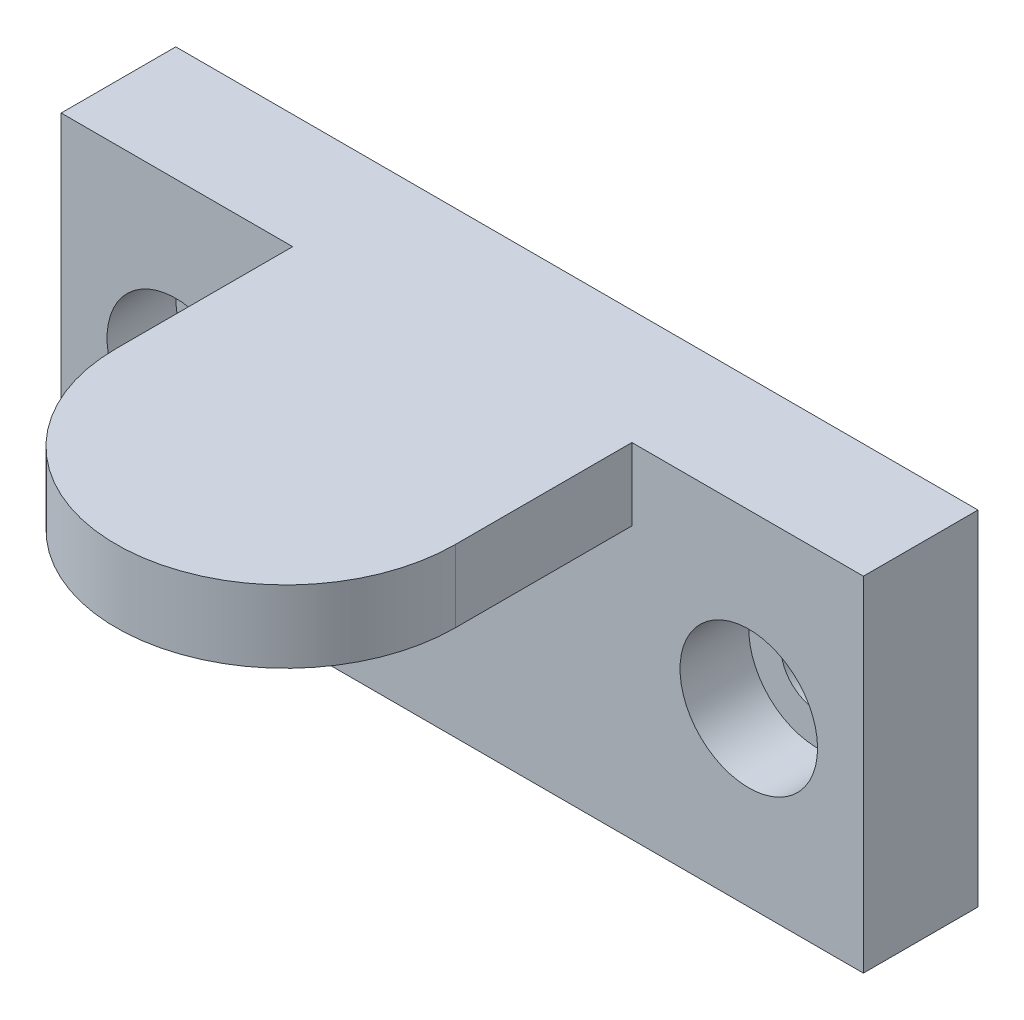
ISO-10303-21;
HEADER;
FILE_DESCRIPTION(('STEP AP214'),'2;1');
FILE_NAME('part.step','',(''),(''),'','','');
FILE_SCHEMA(('AUTOMOTIVE_DESIGN { 1 0 10303 214 1 1 1 1 }'));
ENDSEC;
DATA;
#1=APPLICATION_CONTEXT('core data for automotive mechanical design processes');
#2=APPLICATION_PROTOCOL_DEFINITION('international standard','automotive_design',2000,#1);
#3=PRODUCT_CONTEXT('',#1,'mechanical');
#4=PRODUCT('Part','Part','',(#3));
#5=PRODUCT_RELATED_PRODUCT_CATEGORY('part','',(#4));
#6=PRODUCT_DEFINITION_FORMATION('','',#4);
#7=PRODUCT_DEFINITION_CONTEXT('part definition',#1,'design');
#8=PRODUCT_DEFINITION('design','',#6,#7);
#9=PRODUCT_DEFINITION_SHAPE('','',#8);
#10=(LENGTH_UNIT() NAMED_UNIT(*) SI_UNIT(.MILLI.,.METRE.));
#11=(NAMED_UNIT(*) PLANE_ANGLE_UNIT() SI_UNIT($,.RADIAN.));
#12=(NAMED_UNIT(*) SI_UNIT($,.STERADIAN.) SOLID_ANGLE_UNIT());
#13=UNCERTAINTY_MEASURE_WITH_UNIT(LENGTH_MEASURE(1.E-05),#10,'distance_accuracy_value','');
#14=(GEOMETRIC_REPRESENTATION_CONTEXT(3) GLOBAL_UNCERTAINTY_ASSIGNED_CONTEXT((#13)) GLOBAL_UNIT_ASSIGNED_CONTEXT((#10,
#11,#12)) REPRESENTATION_CONTEXT('',''));
#15=CARTESIAN_POINT('',(0.,0.,0.));
#16=DIRECTION('',(0.,0.,1.));
#17=DIRECTION('',(1.,0.,0.));
#18=AXIS2_PLACEMENT_3D('',#15,#16,#17);
#19=CARTESIAN_POINT('',(0.,0.,10.));
#20=DIRECTION('',(1.,0.,0.));
#21=DIRECTION('',(0.,1.,0.));
#22=AXIS2_PLACEMENT_3D('',#19,#20,#21);
#23=PLANE('',#22);
#24=DIRECTION('',(0.,-1.,0.));
#25=VECTOR('',#24,1.);
#26=CARTESIAN_POINT('',(0.,0.,0.));
#27=LINE('',#26,#25);
#28=CARTESIAN_POINT('',(0.,0.,0.));
#29=VERTEX_POINT('',#28);
#30=CARTESIAN_POINT('',(0.,-30.,0.));
#31=VERTEX_POINT('',#30);
#32=EDGE_CURVE('E202',#29,#31,#27,.T.);
#33=ORIENTED_EDGE('',*,*,#32,.T.);
#34=DIRECTION('',(0.,0.,-1.));
#35=VECTOR('',#34,1.);
#36=CARTESIAN_POINT('',(0.,-30.,10.));
#37=LINE('',#36,#35);
#38=CARTESIAN_POINT('',(0.,-30.,10.));
#39=VERTEX_POINT('',#38);
#40=EDGE_CURVE('E12',#39,#31,#37,.T.);
#41=ORIENTED_EDGE('',*,*,#40,.F.);
#42=DIRECTION('',(0.,-1.,0.));
#43=VECTOR('',#42,1.);
#44=CARTESIAN_POINT('',(0.,0.,10.));
#45=LINE('',#44,#43);
#46=CARTESIAN_POINT('',(0.,0.,10.));
#47=VERTEX_POINT('',#46);
#48=EDGE_CURVE('E214',#47,#39,#45,.T.);
#49=ORIENTED_EDGE('',*,*,#48,.F.);
#50=DIRECTION('',(0.,0.,-1.));
#51=VECTOR('',#50,1.);
#52=CARTESIAN_POINT('',(0.,0.,10.));
#53=LINE('',#52,#51);
#54=EDGE_CURVE('E225',#47,#29,#53,.T.);
#55=ORIENTED_EDGE('',*,*,#54,.T.);
#56=EDGE_LOOP('',(#33,#41,#49,#55));
#57=FACE_BOUND('',#56,.T.);
#58=ADVANCED_FACE('F60',(#57),#23,.F.);
#59=CARTESIAN_POINT('',(0.,-30.,10.));
#60=DIRECTION('',(0.,1.,0.));
#61=DIRECTION('',(0.,0.,1.));
#62=AXIS2_PLACEMENT_3D('',#59,#60,#61);
#63=PLANE('',#62);
#64=DIRECTION('',(1.,0.,0.));
#65=VECTOR('',#64,1.);
#66=CARTESIAN_POINT('',(0.,-30.,0.));
#67=LINE('',#66,#65);
#68=CARTESIAN_POINT('',(70.,-30.,0.));
#69=VERTEX_POINT('',#68);
#70=EDGE_CURVE('E229',#31,#69,#67,.T.);
#71=ORIENTED_EDGE('',*,*,#70,.T.);
#72=DIRECTION('',(0.,0.,-1.));
#73=VECTOR('',#72,1.);
#74=CARTESIAN_POINT('',(70.,-30.,10.));
#75=LINE('',#74,#73);
#76=CARTESIAN_POINT('',(70.,-30.,10.));
#77=VERTEX_POINT('',#76);
#78=EDGE_CURVE('E68',#77,#69,#75,.T.);
#79=ORIENTED_EDGE('',*,*,#78,.F.);
#80=DIRECTION('',(1.,0.,0.));
#81=VECTOR('',#80,1.);
#82=CARTESIAN_POINT('',(0.,-30.,10.));
#83=LINE('',#82,#81);
#84=EDGE_CURVE('E112',#39,#77,#83,.T.);
#85=ORIENTED_EDGE('',*,*,#84,.F.);
#86=ORIENTED_EDGE('',*,*,#40,.T.);
#87=EDGE_LOOP('',(#71,#79,#85,#86));
#88=FACE_BOUND('',#87,.T.);
#89=ADVANCED_FACE('F272',(#88),#63,.F.);
#90=CARTESIAN_POINT('',(70.,0.,10.));
#91=DIRECTION('',(-1.,0.,0.));
#92=DIRECTION('',(0.,-1.,0.));
#93=AXIS2_PLACEMENT_3D('',#90,#91,#92);
#94=PLANE('',#93);
#95=DIRECTION('',(0.,1.,0.));
#96=VECTOR('',#95,1.);
#97=CARTESIAN_POINT('',(70.,0.,0.));
#98=LINE('',#97,#96);
#99=CARTESIAN_POINT('',(70.,0.,0.));
#100=VERTEX_POINT('',#99);
#101=EDGE_CURVE('E232',#69,#100,#98,.T.);
#102=ORIENTED_EDGE('',*,*,#101,.T.);
#103=DIRECTION('',(0.,0.,-1.));
#104=VECTOR('',#103,1.);
#105=CARTESIAN_POINT('',(70.,0.,10.));
#106=LINE('',#105,#104);
#107=CARTESIAN_POINT('',(70.,0.,10.));
#108=VERTEX_POINT('',#107);
#109=EDGE_CURVE('E239',#108,#100,#106,.T.);
#110=ORIENTED_EDGE('',*,*,#109,.F.);
#111=DIRECTION('',(0.,1.,0.));
#112=VECTOR('',#111,1.);
#113=CARTESIAN_POINT('',(70.,0.,10.));
#114=LINE('',#113,#112);
#115=EDGE_CURVE('E219',#77,#108,#114,.T.);
#116=ORIENTED_EDGE('',*,*,#115,.F.);
#117=ORIENTED_EDGE('',*,*,#78,.T.);
#118=EDGE_LOOP('',(#102,#110,#116,#117));
#119=FACE_BOUND('',#118,.T.);
#120=ADVANCED_FACE('F246',(#119),#94,.F.);
#121=CARTESIAN_POINT('',(0.,0.,10.));
#122=DIRECTION('',(0.,-1.,0.));
#123=DIRECTION('',(0.,0.,-1.));
#124=AXIS2_PLACEMENT_3D('',#121,#122,#123);
#125=PLANE('',#124);
#126=DIRECTION('',(-1.,0.,0.));
#127=VECTOR('',#126,1.);
#128=CARTESIAN_POINT('',(0.,0.,0.));
#129=LINE('',#128,#127);
#130=EDGE_CURVE('E105',#100,#29,#129,.T.);
#131=ORIENTED_EDGE('',*,*,#130,.T.);
#132=ORIENTED_EDGE('',*,*,#54,.F.);
#133=DIRECTION('',(-1.,0.,0.));
#134=VECTOR('',#133,1.);
#135=CARTESIAN_POINT('',(0.,0.,10.));
#136=LINE('',#135,#134);
#137=CARTESIAN_POINT('',(20.2,0.,10.));
#138=VERTEX_POINT('',#137);
#139=EDGE_CURVE('E83',#138,#47,#136,.T.);
#140=ORIENTED_EDGE('',*,*,#139,.F.);
#141=DIRECTION('',(0.,0.,-1.));
#142=VECTOR('',#141,1.);
#143=CARTESIAN_POINT('',(20.2,0.,25.4));
#144=LINE('',#143,#142);
#145=CARTESIAN_POINT('',(20.2,0.,25.4));
#146=VERTEX_POINT('',#145);
#147=EDGE_CURVE('E75',#146,#138,#144,.T.);
#148=ORIENTED_EDGE('',*,*,#147,.F.);
#149=CARTESIAN_POINT('',(35.,0.,25.4));
#150=DIRECTION('',(0.,1.,0.));
#151=DIRECTION('',(0.,0.,1.));
#152=AXIS2_PLACEMENT_3D('',#149,#150,#151);
#153=CIRCLE('',#152,14.8);
#154=CARTESIAN_POINT('',(49.8,0.,25.4));
#155=VERTEX_POINT('',#154);
#156=EDGE_CURVE('E139',#146,#155,#153,.T.);
#157=ORIENTED_EDGE('',*,*,#156,.T.);
#158=DIRECTION('',(0.,0.,-1.));
#159=VECTOR('',#158,1.);
#160=CARTESIAN_POINT('',(49.8,0.,25.4));
#161=LINE('',#160,#159);
#162=CARTESIAN_POINT('',(49.8,0.,10.));
#163=VERTEX_POINT('',#162);
#164=EDGE_CURVE('E149',#155,#163,#161,.T.);
#165=ORIENTED_EDGE('',*,*,#164,.T.);
#166=EDGE_CURVE('E222',#108,#163,#136,.T.);
#167=ORIENTED_EDGE('',*,*,#166,.F.);
#168=ORIENTED_EDGE('',*,*,#109,.T.);
#169=EDGE_LOOP('',(#131,#132,#140,#148,#157,#165,#167,#168));
#170=FACE_BOUND('',#169,.T.);
#171=ADVANCED_FACE('F158',(#170),#125,.F.);
#172=CARTESIAN_POINT('',(0.,0.,10.));
#173=DIRECTION('',(0.,0.,1.));
#174=DIRECTION('',(1.,0.,0.));
#175=AXIS2_PLACEMENT_3D('',#172,#173,#174);
#176=PLANE('',#175);
#177=DIRECTION('',(0.,1.,0.));
#178=VECTOR('',#177,1.);
#179=CARTESIAN_POINT('',(49.8,-6.3,10.));
#180=LINE('',#179,#178);
#181=CARTESIAN_POINT('',(49.8,-6.3,10.));
#182=VERTEX_POINT('',#181);
#183=EDGE_CURVE('E152',#182,#163,#180,.T.);
#184=ORIENTED_EDGE('',*,*,#183,.F.);
#185=DIRECTION('',(1.,0.,0.));
#186=VECTOR('',#185,1.);
#187=CARTESIAN_POINT('',(20.2,-6.3,10.));
#188=LINE('',#187,#186);
#189=CARTESIAN_POINT('',(20.2,-6.3,10.));
#190=VERTEX_POINT('',#189);
#191=EDGE_CURVE('E172',#190,#182,#188,.T.);
#192=ORIENTED_EDGE('',*,*,#191,.F.);
#193=DIRECTION('',(0.,1.,0.));
#194=VECTOR('',#193,1.);
#195=CARTESIAN_POINT('',(20.2,-6.3,10.));
#196=LINE('',#195,#194);
#197=EDGE_CURVE('E160',#190,#138,#196,.T.);
#198=ORIENTED_EDGE('',*,*,#197,.T.);
#199=ORIENTED_EDGE('',*,*,#139,.T.);
#200=ORIENTED_EDGE('',*,*,#48,.T.);
#201=ORIENTED_EDGE('',*,*,#84,.T.);
#202=ORIENTED_EDGE('',*,*,#115,.T.);
#203=ORIENTED_EDGE('',*,*,#166,.T.);
#204=EDGE_LOOP('',(#184,#192,#198,#199,#200,#201,#202,#203));
#205=FACE_BOUND('',#204,.T.);
#206=CARTESIAN_POINT('',(10.,-15.,10.));
#207=DIRECTION('',(0.,0.,1.));
#208=DIRECTION('',(1.,0.,0.));
#209=AXIS2_PLACEMENT_3D('',#206,#207,#208);
#210=CIRCLE('',#209,6.);
#211=CARTESIAN_POINT('',(16.,-15.,10.));
#212=VERTEX_POINT('',#211);
#213=EDGE_CURVE('E203',#212,#212,#210,.T.);
#214=ORIENTED_EDGE('',*,*,#213,.F.);
#215=EDGE_LOOP('',(#214));
#216=FACE_BOUND('',#215,.T.);
#217=CARTESIAN_POINT('',(60.,-15.,10.));
#218=DIRECTION('',(0.,0.,1.));
#219=DIRECTION('',(1.,0.,0.));
#220=AXIS2_PLACEMENT_3D('',#217,#218,#219);
#221=CIRCLE('',#220,6.);
#222=CARTESIAN_POINT('',(66.,-15.,10.));
#223=VERTEX_POINT('',#222);
#224=EDGE_CURVE('E207',#223,#223,#221,.T.);
#225=ORIENTED_EDGE('',*,*,#224,.F.);
#226=EDGE_LOOP('',(#225));
#227=FACE_BOUND('',#226,.T.);
#228=ADVANCED_FACE('F255',(#205,#216,#227),#176,.T.);
#229=CARTESIAN_POINT('',(0.,0.,0.));
#230=DIRECTION('',(0.,0.,1.));
#231=DIRECTION('',(1.,0.,0.));
#232=AXIS2_PLACEMENT_3D('',#229,#230,#231);
#233=PLANE('',#232);
#234=CARTESIAN_POINT('',(10.,-15.,0.));
#235=DIRECTION('',(0.,0.,1.));
#236=DIRECTION('',(1.,0.,0.));
#237=AXIS2_PLACEMENT_3D('',#234,#235,#236);
#238=CIRCLE('',#237,3.2);
#239=CARTESIAN_POINT('',(13.2,-15.,0.));
#240=VERTEX_POINT('',#239);
#241=EDGE_CURVE('E182',#240,#240,#238,.T.);
#242=ORIENTED_EDGE('',*,*,#241,.T.);
#243=EDGE_LOOP('',(#242));
#244=FACE_BOUND('',#243,.T.);
#245=CARTESIAN_POINT('',(60.,-15.,0.));
#246=DIRECTION('',(0.,0.,1.));
#247=DIRECTION('',(1.,0.,0.));
#248=AXIS2_PLACEMENT_3D('',#245,#246,#247);
#249=CIRCLE('',#248,3.2);
#250=CARTESIAN_POINT('',(63.2,-15.,0.));
#251=VERTEX_POINT('',#250);
#252=EDGE_CURVE('E169',#251,#251,#249,.T.);
#253=ORIENTED_EDGE('',*,*,#252,.T.);
#254=EDGE_LOOP('',(#253));
#255=FACE_BOUND('',#254,.T.);
#256=ORIENTED_EDGE('',*,*,#32,.F.);
#257=ORIENTED_EDGE('',*,*,#130,.F.);
#258=ORIENTED_EDGE('',*,*,#101,.F.);
#259=ORIENTED_EDGE('',*,*,#70,.F.);
#260=EDGE_LOOP('',(#256,#257,#258,#259));
#261=FACE_BOUND('',#260,.T.);
#262=ADVANCED_FACE('F250',(#244,#255,#261),#233,.F.);
#263=CARTESIAN_POINT('',(60.,-15.,4.));
#264=DIRECTION('',(0.,0.,1.));
#265=DIRECTION('',(1.,0.,0.));
#266=AXIS2_PLACEMENT_3D('',#263,#264,#265);
#267=CYLINDRICAL_SURFACE('',#266,6.);
#268=CARTESIAN_POINT('',(60.,-15.,4.));
#269=DIRECTION('',(0.,0.,1.));
#270=DIRECTION('',(1.,0.,0.));
#271=AXIS2_PLACEMENT_3D('',#268,#269,#270);
#272=CIRCLE('',#271,6.);
#273=CARTESIAN_POINT('',(66.,-15.,4.));
#274=VERTEX_POINT('',#273);
#275=EDGE_CURVE('E186',#274,#274,#272,.T.);
#276=ORIENTED_EDGE('',*,*,#275,.F.);
#277=EDGE_LOOP('',(#276));
#278=FACE_BOUND('',#277,.T.);
#279=ORIENTED_EDGE('',*,*,#224,.T.);
#280=EDGE_LOOP('',(#279));
#281=FACE_BOUND('',#280,.T.);
#282=ADVANCED_FACE('F285',(#278,#281),#267,.F.);
#283=CARTESIAN_POINT('',(60.,-15.,4.));
#284=DIRECTION('',(0.,0.,1.));
#285=DIRECTION('',(1.,0.,0.));
#286=AXIS2_PLACEMENT_3D('',#283,#284,#285);
#287=PLANE('',#286);
#288=CARTESIAN_POINT('',(60.,-15.,4.));
#289=DIRECTION('',(0.,0.,1.));
#290=DIRECTION('',(1.,0.,0.));
#291=AXIS2_PLACEMENT_3D('',#288,#289,#290);
#292=CIRCLE('',#291,3.2);
#293=CARTESIAN_POINT('',(63.2,-15.,4.));
#294=VERTEX_POINT('',#293);
#295=EDGE_CURVE('E191',#294,#294,#292,.T.);
#296=ORIENTED_EDGE('',*,*,#295,.F.);
#297=EDGE_LOOP('',(#296));
#298=FACE_BOUND('',#297,.T.);
#299=ORIENTED_EDGE('',*,*,#275,.T.);
#300=EDGE_LOOP('',(#299));
#301=FACE_BOUND('',#300,.T.);
#302=ADVANCED_FACE('F289',(#298,#301),#287,.T.);
#303=CARTESIAN_POINT('',(10.,-15.,4.));
#304=DIRECTION('',(0.,0.,1.));
#305=DIRECTION('',(1.,0.,0.));
#306=AXIS2_PLACEMENT_3D('',#303,#304,#305);
#307=CYLINDRICAL_SURFACE('',#306,6.);
#308=CARTESIAN_POINT('',(10.,-15.,4.));
#309=DIRECTION('',(0.,0.,1.));
#310=DIRECTION('',(1.,0.,0.));
#311=AXIS2_PLACEMENT_3D('',#308,#309,#310);
#312=CIRCLE('',#311,6.);
#313=CARTESIAN_POINT('',(16.,-15.,4.));
#314=VERTEX_POINT('',#313);
#315=EDGE_CURVE('E198',#314,#314,#312,.T.);
#316=ORIENTED_EDGE('',*,*,#315,.F.);
#317=EDGE_LOOP('',(#316));
#318=FACE_BOUND('',#317,.T.);
#319=ORIENTED_EDGE('',*,*,#213,.T.);
#320=EDGE_LOOP('',(#319));
#321=FACE_BOUND('',#320,.T.);
#322=ADVANCED_FACE('F292',(#318,#321),#307,.F.);
#323=CARTESIAN_POINT('',(10.,-15.,4.));
#324=DIRECTION('',(0.,0.,1.));
#325=DIRECTION('',(1.,0.,0.));
#326=AXIS2_PLACEMENT_3D('',#323,#324,#325);
#327=PLANE('',#326);
#328=CARTESIAN_POINT('',(10.,-15.,4.));
#329=DIRECTION('',(0.,0.,1.));
#330=DIRECTION('',(1.,0.,0.));
#331=AXIS2_PLACEMENT_3D('',#328,#329,#330);
#332=CIRCLE('',#331,3.2);
#333=CARTESIAN_POINT('',(13.2,-15.,4.));
#334=VERTEX_POINT('',#333);
#335=EDGE_CURVE('E187',#334,#334,#332,.T.);
#336=ORIENTED_EDGE('',*,*,#335,.F.);
#337=EDGE_LOOP('',(#336));
#338=FACE_BOUND('',#337,.T.);
#339=ORIENTED_EDGE('',*,*,#315,.T.);
#340=EDGE_LOOP('',(#339));
#341=FACE_BOUND('',#340,.T.);
#342=ADVANCED_FACE('F299',(#338,#341),#327,.T.);
#343=CARTESIAN_POINT('',(60.,-15.,0.));
#344=DIRECTION('',(0.,0.,1.));
#345=DIRECTION('',(1.,0.,0.));
#346=AXIS2_PLACEMENT_3D('',#343,#344,#345);
#347=CYLINDRICAL_SURFACE('',#346,3.2);
#348=ORIENTED_EDGE('',*,*,#252,.F.);
#349=EDGE_LOOP('',(#348));
#350=FACE_BOUND('',#349,.T.);
#351=ORIENTED_EDGE('',*,*,#295,.T.);
#352=EDGE_LOOP('',(#351));
#353=FACE_BOUND('',#352,.T.);
#354=ADVANCED_FACE('F303',(#350,#353),#347,.F.);
#355=CARTESIAN_POINT('',(10.,-15.,0.));
#356=DIRECTION('',(0.,0.,1.));
#357=DIRECTION('',(1.,0.,0.));
#358=AXIS2_PLACEMENT_3D('',#355,#356,#357);
#359=CYLINDRICAL_SURFACE('',#358,3.2);
#360=ORIENTED_EDGE('',*,*,#241,.F.);
#361=EDGE_LOOP('',(#360));
#362=FACE_BOUND('',#361,.T.);
#363=ORIENTED_EDGE('',*,*,#335,.T.);
#364=EDGE_LOOP('',(#363));
#365=FACE_BOUND('',#364,.T.);
#366=ADVANCED_FACE('F306',(#362,#365),#359,.F.);
#367=CARTESIAN_POINT('',(35.,-6.3,25.4));
#368=DIRECTION('',(0.,1.,0.));
#369=DIRECTION('',(0.,0.,1.));
#370=AXIS2_PLACEMENT_3D('',#367,#368,#369);
#371=CYLINDRICAL_SURFACE('',#370,14.8);
#372=ORIENTED_EDGE('',*,*,#156,.F.);
#373=DIRECTION('',(0.,1.,0.));
#374=VECTOR('',#373,1.);
#375=CARTESIAN_POINT('',(20.2,-6.3,25.4));
#376=LINE('',#375,#374);
#377=CARTESIAN_POINT('',(20.2,-6.3,25.4));
#378=VERTEX_POINT('',#377);
#379=EDGE_CURVE('E146',#146,#378,#376,.F.);
#380=ORIENTED_EDGE('',*,*,#379,.T.);
#381=CARTESIAN_POINT('',(35.,-6.3,25.4));
#382=DIRECTION('',(0.,1.,0.));
#383=DIRECTION('',(0.,0.,1.));
#384=AXIS2_PLACEMENT_3D('',#381,#382,#383);
#385=CIRCLE('',#384,14.8);
#386=CARTESIAN_POINT('',(49.8,-6.3,25.4));
#387=VERTEX_POINT('',#386);
#388=EDGE_CURVE('E141',#378,#387,#385,.T.);
#389=ORIENTED_EDGE('',*,*,#388,.T.);
#390=DIRECTION('',(0.,1.,0.));
#391=VECTOR('',#390,1.);
#392=CARTESIAN_POINT('',(49.8,-6.3,25.4));
#393=LINE('',#392,#391);
#394=EDGE_CURVE('E135',#155,#387,#393,.F.);
#395=ORIENTED_EDGE('',*,*,#394,.F.);
#396=EDGE_LOOP('',(#372,#380,#389,#395));
#397=FACE_BOUND('',#396,.T.);
#398=ADVANCED_FACE('F137',(#397),#371,.T.);
#399=CARTESIAN_POINT('',(35.,-6.3,25.4));
#400=DIRECTION('',(0.,1.,0.));
#401=DIRECTION('',(0.,0.,1.));
#402=AXIS2_PLACEMENT_3D('',#399,#400,#401);
#403=PLANE('',#402);
#404=ORIENTED_EDGE('',*,*,#388,.F.);
#405=DIRECTION('',(0.,0.,-1.));
#406=VECTOR('',#405,1.);
#407=CARTESIAN_POINT('',(20.2,-6.3,25.4));
#408=LINE('',#407,#406);
#409=EDGE_CURVE('E156',#378,#190,#408,.T.);
#410=ORIENTED_EDGE('',*,*,#409,.T.);
#411=ORIENTED_EDGE('',*,*,#191,.T.);
#412=DIRECTION('',(0.,0.,-1.));
#413=VECTOR('',#412,1.);
#414=CARTESIAN_POINT('',(49.8,-6.3,25.4));
#415=LINE('',#414,#413);
#416=EDGE_CURVE('E175',#387,#182,#415,.T.);
#417=ORIENTED_EDGE('',*,*,#416,.F.);
#418=EDGE_LOOP('',(#404,#410,#411,#417));
#419=FACE_BOUND('',#418,.T.);
#420=ADVANCED_FACE('F259',(#419),#403,.F.);
#421=CARTESIAN_POINT('',(49.8,-6.3,25.4));
#422=DIRECTION('',(1.,0.,0.));
#423=DIRECTION('',(0.,0.,-1.));
#424=AXIS2_PLACEMENT_3D('',#421,#422,#423);
#425=PLANE('',#424);
#426=ORIENTED_EDGE('',*,*,#164,.F.);
#427=ORIENTED_EDGE('',*,*,#394,.T.);
#428=ORIENTED_EDGE('',*,*,#416,.T.);
#429=ORIENTED_EDGE('',*,*,#183,.T.);
#430=EDGE_LOOP('',(#426,#427,#428,#429));
#431=FACE_BOUND('',#430,.T.);
#432=ADVANCED_FACE('F150',(#431),#425,.T.);
#433=CARTESIAN_POINT('',(20.2,-6.3,25.4));
#434=DIRECTION('',(1.,0.,0.));
#435=DIRECTION('',(0.,0.,-1.));
#436=AXIS2_PLACEMENT_3D('',#433,#434,#435);
#437=PLANE('',#436);
#438=ORIENTED_EDGE('',*,*,#147,.T.);
#439=ORIENTED_EDGE('',*,*,#197,.F.);
#440=ORIENTED_EDGE('',*,*,#409,.F.);
#441=ORIENTED_EDGE('',*,*,#379,.F.);
#442=EDGE_LOOP('',(#438,#439,#440,#441));
#443=FACE_BOUND('',#442,.T.);
#444=ADVANCED_FACE('F261',(#443),#437,.F.);
#445=CLOSED_SHELL('',(#58,#89,#120,#171,#228,#262,#282,#302,#322,#342,#354,#366,#398,#420,#432,#444));
#446=MANIFOLD_SOLID_BREP('B2',#445);
#447=ADVANCED_BREP_SHAPE_REPRESENTATION('',(#18,#446),#14);
#448=SHAPE_DEFINITION_REPRESENTATION(#9,#447);
ENDSEC;
END-ISO-10303-21;
